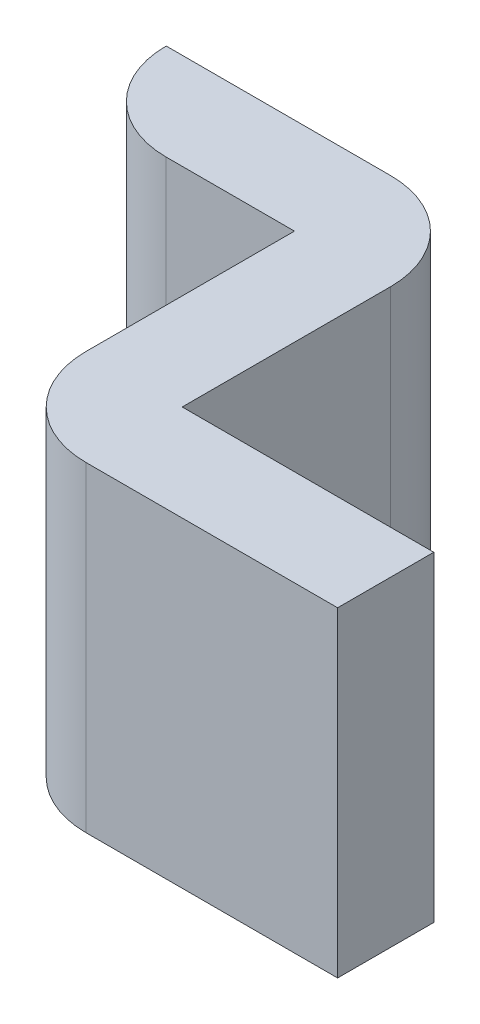
ISO-10303-21;
HEADER;
FILE_DESCRIPTION(('STEP AP214'),'2;1');
FILE_NAME('part.step','',(''),(''),'','','');
FILE_SCHEMA(('AUTOMOTIVE_DESIGN { 1 0 10303 214 1 1 1 1 }'));
ENDSEC;
DATA;
#1=APPLICATION_CONTEXT('core data for automotive mechanical design processes');
#2=APPLICATION_PROTOCOL_DEFINITION('international standard','automotive_design',2000,#1);
#3=PRODUCT_CONTEXT('',#1,'mechanical');
#4=PRODUCT('Part','Part','',(#3));
#5=PRODUCT_RELATED_PRODUCT_CATEGORY('part','',(#4));
#6=PRODUCT_DEFINITION_FORMATION('','',#4);
#7=PRODUCT_DEFINITION_CONTEXT('part definition',#1,'design');
#8=PRODUCT_DEFINITION('design','',#6,#7);
#9=PRODUCT_DEFINITION_SHAPE('','',#8);
#10=(LENGTH_UNIT() NAMED_UNIT(*) SI_UNIT(.MILLI.,.METRE.));
#11=(NAMED_UNIT(*) PLANE_ANGLE_UNIT() SI_UNIT($,.RADIAN.));
#12=(NAMED_UNIT(*) SI_UNIT($,.STERADIAN.) SOLID_ANGLE_UNIT());
#13=UNCERTAINTY_MEASURE_WITH_UNIT(LENGTH_MEASURE(1.E-05),#10,'distance_accuracy_value','');
#14=(GEOMETRIC_REPRESENTATION_CONTEXT(3) GLOBAL_UNCERTAINTY_ASSIGNED_CONTEXT((#13)) GLOBAL_UNIT_ASSIGNED_CONTEXT((#10,
#11,#12)) REPRESENTATION_CONTEXT('',''));
#15=CARTESIAN_POINT('',(0.,0.,0.));
#16=DIRECTION('',(0.,0.,1.));
#17=DIRECTION('',(1.,0.,0.));
#18=AXIS2_PLACEMENT_3D('',#15,#16,#17);
#19=CARTESIAN_POINT('',(1.4397,-0.127,0.));
#20=DIRECTION('',(0.,0.,1.));
#21=DIRECTION('',(1.,0.,0.));
#22=AXIS2_PLACEMENT_3D('',#19,#20,#21);
#23=PLANE('',#22);
#24=DIRECTION('',(0.,-1.,0.));
#25=VECTOR('',#24,1.);
#26=CARTESIAN_POINT('',(1.2619,-0.127,0.));
#27=LINE('',#26,#25);
#28=CARTESIAN_POINT('',(1.2619,0.127,0.));
#29=VERTEX_POINT('',#28);
#30=CARTESIAN_POINT('',(1.2619,-0.127,0.));
#31=VERTEX_POINT('',#30);
#32=EDGE_CURVE('E119',#29,#31,#27,.T.);
#33=ORIENTED_EDGE('',*,*,#32,.F.);
#34=DIRECTION('',(1.,0.,0.));
#35=VECTOR('',#34,1.);
#36=CARTESIAN_POINT('',(1.2619,0.127,0.));
#37=LINE('',#36,#35);
#38=CARTESIAN_POINT('',(1.4397,0.127,0.));
#39=VERTEX_POINT('',#38);
#40=EDGE_CURVE('E114',#29,#39,#37,.T.);
#41=ORIENTED_EDGE('',*,*,#40,.T.);
#42=DIRECTION('',(0.,-1.,0.));
#43=VECTOR('',#42,1.);
#44=CARTESIAN_POINT('',(1.4397,-0.127,0.));
#45=LINE('',#44,#43);
#46=CARTESIAN_POINT('',(1.4397,-0.127,0.));
#47=VERTEX_POINT('',#46);
#48=EDGE_CURVE('E90',#47,#39,#45,.F.);
#49=ORIENTED_EDGE('',*,*,#48,.F.);
#50=DIRECTION('',(1.,0.,0.));
#51=VECTOR('',#50,1.);
#52=CARTESIAN_POINT('',(1.2619,-0.127,0.));
#53=LINE('',#52,#51);
#54=EDGE_CURVE('E135',#31,#47,#53,.T.);
#55=ORIENTED_EDGE('',*,*,#54,.F.);
#56=EDGE_LOOP('',(#33,#41,#49,#55));
#57=FACE_BOUND('',#56,.T.);
#58=ADVANCED_FACE('F16',(#57),#23,.F.);
#59=CARTESIAN_POINT('',(1.4397,-0.127,0.0762));
#60=DIRECTION('',(0.,-1.,0.));
#61=DIRECTION('',(0.,0.,-1.));
#62=AXIS2_PLACEMENT_3D('',#59,#60,#61);
#63=CYLINDRICAL_SURFACE('',#62,0.0762);
#64=CARTESIAN_POINT('',(1.4397,0.127,0.0762));
#65=DIRECTION('',(0.,-1.,0.));
#66=DIRECTION('',(0.,0.,-1.));
#67=AXIS2_PLACEMENT_3D('',#64,#65,#66);
#68=CIRCLE('',#67,0.0762);
#69=CARTESIAN_POINT('',(1.5159,0.127,0.0762));
#70=VERTEX_POINT('',#69);
#71=EDGE_CURVE('E19',#39,#70,#68,.T.);
#72=ORIENTED_EDGE('',*,*,#71,.T.);
#73=DIRECTION('',(0.,1.,0.));
#74=VECTOR('',#73,1.);
#75=CARTESIAN_POINT('',(1.5159,-0.127,0.0762));
#76=LINE('',#75,#74);
#77=CARTESIAN_POINT('',(1.5159,-0.127,0.0762));
#78=VERTEX_POINT('',#77);
#79=EDGE_CURVE('E97',#70,#78,#76,.F.);
#80=ORIENTED_EDGE('',*,*,#79,.T.);
#81=CARTESIAN_POINT('',(1.4397,-0.127,0.0762));
#82=DIRECTION('',(0.,-1.,0.));
#83=DIRECTION('',(0.,0.,-1.));
#84=AXIS2_PLACEMENT_3D('',#81,#82,#83);
#85=CIRCLE('',#84,0.0762);
#86=EDGE_CURVE('E160',#47,#78,#85,.T.);
#87=ORIENTED_EDGE('',*,*,#86,.F.);
#88=ORIENTED_EDGE('',*,*,#48,.T.);
#89=EDGE_LOOP('',(#72,#80,#87,#88));
#90=FACE_BOUND('',#89,.T.);
#91=ADVANCED_FACE('F113',(#90),#63,.T.);
#92=CARTESIAN_POINT('',(1.5159,-0.127,0.2413));
#93=DIRECTION('',(-1.,0.,0.));
#94=DIRECTION('',(0.,0.,1.));
#95=AXIS2_PLACEMENT_3D('',#92,#93,#94);
#96=PLANE('',#95);
#97=ORIENTED_EDGE('',*,*,#79,.F.);
#98=DIRECTION('',(0.,0.,-1.));
#99=VECTOR('',#98,1.);
#100=CARTESIAN_POINT('',(1.5159,0.127,0.));
#101=LINE('',#100,#99);
#102=CARTESIAN_POINT('',(1.5159,0.127,0.2413));
#103=VERTEX_POINT('',#102);
#104=EDGE_CURVE('E101',#70,#103,#101,.F.);
#105=ORIENTED_EDGE('',*,*,#104,.T.);
#106=DIRECTION('',(0.,1.,0.));
#107=VECTOR('',#106,1.);
#108=CARTESIAN_POINT('',(1.5159,-0.127,0.2413));
#109=LINE('',#108,#107);
#110=CARTESIAN_POINT('',(1.5159,-0.127,0.2413));
#111=VERTEX_POINT('',#110);
#112=EDGE_CURVE('E103',#103,#111,#109,.F.);
#113=ORIENTED_EDGE('',*,*,#112,.T.);
#114=DIRECTION('',(0.,0.,-1.));
#115=VECTOR('',#114,1.);
#116=CARTESIAN_POINT('',(1.5159,-0.127,0.));
#117=LINE('',#116,#115);
#118=EDGE_CURVE('E102',#78,#111,#117,.F.);
#119=ORIENTED_EDGE('',*,*,#118,.F.);
#120=EDGE_LOOP('',(#97,#105,#113,#119));
#121=FACE_BOUND('',#120,.T.);
#122=ADVANCED_FACE('F99',(#121),#96,.F.);
#123=CARTESIAN_POINT('',(1.7152,-0.127,0.2413));
#124=DIRECTION('',(0.,0.,1.));
#125=DIRECTION('',(1.,0.,0.));
#126=AXIS2_PLACEMENT_3D('',#123,#124,#125);
#127=PLANE('',#126);
#128=ORIENTED_EDGE('',*,*,#112,.F.);
#129=DIRECTION('',(1.,0.,0.));
#130=VECTOR('',#129,1.);
#131=CARTESIAN_POINT('',(1.2619,0.127,0.2413));
#132=LINE('',#131,#130);
#133=CARTESIAN_POINT('',(1.7152,0.127,0.2413));
#134=VERTEX_POINT('',#133);
#135=EDGE_CURVE('E111',#103,#134,#132,.T.);
#136=ORIENTED_EDGE('',*,*,#135,.T.);
#137=DIRECTION('',(0.,1.,0.));
#138=VECTOR('',#137,1.);
#139=CARTESIAN_POINT('',(1.7152,-0.127,0.2413));
#140=LINE('',#139,#138);
#141=CARTESIAN_POINT('',(1.7152,-0.127,0.2413));
#142=VERTEX_POINT('',#141);
#143=EDGE_CURVE('E132',#134,#142,#140,.F.);
#144=ORIENTED_EDGE('',*,*,#143,.T.);
#145=DIRECTION('',(1.,0.,0.));
#146=VECTOR('',#145,1.);
#147=CARTESIAN_POINT('',(1.2619,-0.127,0.2413));
#148=LINE('',#147,#146);
#149=EDGE_CURVE('E139',#111,#142,#148,.T.);
#150=ORIENTED_EDGE('',*,*,#149,.F.);
#151=EDGE_LOOP('',(#128,#136,#144,#150));
#152=FACE_BOUND('',#151,.T.);
#153=ADVANCED_FACE('F220',(#152),#127,.F.);
#154=CARTESIAN_POINT('',(1.4397,-0.127,0.0762));
#155=DIRECTION('',(1.,0.,0.));
#156=DIRECTION('',(0.,0.,-1.));
#157=AXIS2_PLACEMENT_3D('',#154,#155,#156);
#158=PLANE('',#157);
#159=DIRECTION('',(0.,-1.,0.));
#160=VECTOR('',#159,1.);
#161=CARTESIAN_POINT('',(1.4397,-0.127,0.2413));
#162=LINE('',#161,#160);
#163=CARTESIAN_POINT('',(1.4397,0.127,0.2413));
#164=VERTEX_POINT('',#163);
#165=CARTESIAN_POINT('',(1.4397,-0.127,0.2413));
#166=VERTEX_POINT('',#165);
#167=EDGE_CURVE('E115',#164,#166,#162,.T.);
#168=ORIENTED_EDGE('',*,*,#167,.F.);
#169=DIRECTION('',(0.,0.,-1.));
#170=VECTOR('',#169,1.);
#171=CARTESIAN_POINT('',(1.4397,0.127,0.));
#172=LINE('',#171,#170);
#173=CARTESIAN_POINT('',(1.4397,0.127,0.0762));
#174=VERTEX_POINT('',#173);
#175=EDGE_CURVE('E166',#164,#174,#172,.T.);
#176=ORIENTED_EDGE('',*,*,#175,.T.);
#177=DIRECTION('',(0.,1.,0.));
#178=VECTOR('',#177,1.);
#179=CARTESIAN_POINT('',(1.4397,-0.127,0.0762));
#180=LINE('',#179,#178);
#181=CARTESIAN_POINT('',(1.4397,-0.127,0.0762));
#182=VERTEX_POINT('',#181);
#183=EDGE_CURVE('E127',#174,#182,#180,.F.);
#184=ORIENTED_EDGE('',*,*,#183,.T.);
#185=DIRECTION('',(0.,0.,-1.));
#186=VECTOR('',#185,1.);
#187=CARTESIAN_POINT('',(1.4397,-0.127,0.));
#188=LINE('',#187,#186);
#189=EDGE_CURVE('E159',#166,#182,#188,.T.);
#190=ORIENTED_EDGE('',*,*,#189,.F.);
#191=EDGE_LOOP('',(#168,#176,#184,#190));
#192=FACE_BOUND('',#191,.T.);
#193=ADVANCED_FACE('F229',(#192),#158,.F.);
#194=CARTESIAN_POINT('',(1.3381,-0.127,0.0762));
#195=DIRECTION('',(0.,0.,-1.));
#196=DIRECTION('',(-1.,0.,0.));
#197=AXIS2_PLACEMENT_3D('',#194,#195,#196);
#198=PLANE('',#197);
#199=ORIENTED_EDGE('',*,*,#183,.F.);
#200=DIRECTION('',(1.,0.,0.));
#201=VECTOR('',#200,1.);
#202=CARTESIAN_POINT('',(1.2619,0.127,0.0762));
#203=LINE('',#202,#201);
#204=CARTESIAN_POINT('',(1.3381,0.127,0.0762));
#205=VERTEX_POINT('',#204);
#206=EDGE_CURVE('E164',#174,#205,#203,.F.);
#207=ORIENTED_EDGE('',*,*,#206,.T.);
#208=DIRECTION('',(0.,-1.,0.));
#209=VECTOR('',#208,1.);
#210=CARTESIAN_POINT('',(1.3381,-0.127,0.0762));
#211=LINE('',#210,#209);
#212=CARTESIAN_POINT('',(1.3381,-0.127,0.0762));
#213=VERTEX_POINT('',#212);
#214=EDGE_CURVE('E125',#213,#205,#211,.F.);
#215=ORIENTED_EDGE('',*,*,#214,.F.);
#216=DIRECTION('',(1.,0.,0.));
#217=VECTOR('',#216,1.);
#218=CARTESIAN_POINT('',(1.2619,-0.127,0.0762));
#219=LINE('',#218,#217);
#220=EDGE_CURVE('E155',#182,#213,#219,.F.);
#221=ORIENTED_EDGE('',*,*,#220,.F.);
#222=EDGE_LOOP('',(#199,#207,#215,#221));
#223=FACE_BOUND('',#222,.T.);
#224=ADVANCED_FACE('F214',(#223),#198,.F.);
#225=CARTESIAN_POINT('',(1.3381,-0.127,0.));
#226=DIRECTION('',(0.,-1.,0.));
#227=DIRECTION('',(0.,0.,-1.));
#228=AXIS2_PLACEMENT_3D('',#225,#226,#227);
#229=CYLINDRICAL_SURFACE('',#228,0.0762);
#230=CARTESIAN_POINT('',(1.3381,0.127,0.));
#231=DIRECTION('',(0.,-1.,0.));
#232=DIRECTION('',(0.,0.,-1.));
#233=AXIS2_PLACEMENT_3D('',#230,#231,#232);
#234=CIRCLE('',#233,0.0762);
#235=EDGE_CURVE('E162',#205,#29,#234,.T.);
#236=ORIENTED_EDGE('',*,*,#235,.T.);
#237=ORIENTED_EDGE('',*,*,#32,.T.);
#238=CARTESIAN_POINT('',(1.3381,-0.127,0.));
#239=DIRECTION('',(0.,-1.,0.));
#240=DIRECTION('',(0.,0.,-1.));
#241=AXIS2_PLACEMENT_3D('',#238,#239,#240);
#242=CIRCLE('',#241,0.0762);
#243=EDGE_CURVE('E151',#213,#31,#242,.T.);
#244=ORIENTED_EDGE('',*,*,#243,.F.);
#245=ORIENTED_EDGE('',*,*,#214,.T.);
#246=EDGE_LOOP('',(#236,#237,#244,#245));
#247=FACE_BOUND('',#246,.T.);
#248=ADVANCED_FACE('F217',(#247),#229,.T.);
#249=CARTESIAN_POINT('',(1.5159,-0.127,0.2413));
#250=DIRECTION('',(0.,-1.,0.));
#251=DIRECTION('',(0.,0.,-1.));
#252=AXIS2_PLACEMENT_3D('',#249,#250,#251);
#253=CYLINDRICAL_SURFACE('',#252,0.0762);
#254=CARTESIAN_POINT('',(1.5159,0.127,0.2413));
#255=DIRECTION('',(0.,-1.,0.));
#256=DIRECTION('',(0.,0.,-1.));
#257=AXIS2_PLACEMENT_3D('',#254,#255,#256);
#258=CIRCLE('',#257,0.0762);
#259=CARTESIAN_POINT('',(1.5159,0.127,0.3175));
#260=VERTEX_POINT('',#259);
#261=EDGE_CURVE('E148',#260,#164,#258,.T.);
#262=ORIENTED_EDGE('',*,*,#261,.T.);
#263=ORIENTED_EDGE('',*,*,#167,.T.);
#264=CARTESIAN_POINT('',(1.5159,-0.127,0.2413));
#265=DIRECTION('',(0.,-1.,0.));
#266=DIRECTION('',(0.,0.,-1.));
#267=AXIS2_PLACEMENT_3D('',#264,#265,#266);
#268=CIRCLE('',#267,0.0762);
#269=CARTESIAN_POINT('',(1.5159,-0.127,0.3175));
#270=VERTEX_POINT('',#269);
#271=EDGE_CURVE('E156',#270,#166,#268,.T.);
#272=ORIENTED_EDGE('',*,*,#271,.F.);
#273=DIRECTION('',(0.,1.,0.));
#274=VECTOR('',#273,1.);
#275=CARTESIAN_POINT('',(1.5159,-0.127,0.3175));
#276=LINE('',#275,#274);
#277=EDGE_CURVE('E154',#270,#260,#276,.T.);
#278=ORIENTED_EDGE('',*,*,#277,.T.);
#279=EDGE_LOOP('',(#262,#263,#272,#278));
#280=FACE_BOUND('',#279,.T.);
#281=ADVANCED_FACE('F230',(#280),#253,.T.);
#282=CARTESIAN_POINT('',(1.2619,0.127,0.));
#283=DIRECTION('',(0.,-1.,0.));
#284=DIRECTION('',(0.,0.,-1.));
#285=AXIS2_PLACEMENT_3D('',#282,#283,#284);
#286=PLANE('',#285);
#287=ORIENTED_EDGE('',*,*,#206,.F.);
#288=ORIENTED_EDGE('',*,*,#175,.F.);
#289=ORIENTED_EDGE('',*,*,#261,.F.);
#290=DIRECTION('',(-1.,0.,0.));
#291=VECTOR('',#290,1.);
#292=CARTESIAN_POINT('',(1.5159,0.127,0.3175));
#293=LINE('',#292,#291);
#294=CARTESIAN_POINT('',(1.7152,0.127,0.3175));
#295=VERTEX_POINT('',#294);
#296=EDGE_CURVE('E182',#260,#295,#293,.F.);
#297=ORIENTED_EDGE('',*,*,#296,.T.);
#298=DIRECTION('',(0.,0.,1.));
#299=VECTOR('',#298,1.);
#300=CARTESIAN_POINT('',(1.7152,0.127,0.3175));
#301=LINE('',#300,#299);
#302=EDGE_CURVE('E136',#295,#134,#301,.F.);
#303=ORIENTED_EDGE('',*,*,#302,.T.);
#304=ORIENTED_EDGE('',*,*,#135,.F.);
#305=ORIENTED_EDGE('',*,*,#104,.F.);
#306=ORIENTED_EDGE('',*,*,#71,.F.);
#307=ORIENTED_EDGE('',*,*,#40,.F.);
#308=ORIENTED_EDGE('',*,*,#235,.F.);
#309=EDGE_LOOP('',(#287,#288,#289,#297,#303,#304,#305,#306,#307,#308));
#310=FACE_BOUND('',#309,.T.);
#311=ADVANCED_FACE('F108',(#310),#286,.F.);
#312=CARTESIAN_POINT('',(1.7152,-0.127,0.3175));
#313=DIRECTION('',(-1.,0.,0.));
#314=DIRECTION('',(0.,0.,1.));
#315=AXIS2_PLACEMENT_3D('',#312,#313,#314);
#316=PLANE('',#315);
#317=ORIENTED_EDGE('',*,*,#143,.F.);
#318=ORIENTED_EDGE('',*,*,#302,.F.);
#319=DIRECTION('',(0.,1.,0.));
#320=VECTOR('',#319,1.);
#321=CARTESIAN_POINT('',(1.7152,-0.127,0.3175));
#322=LINE('',#321,#320);
#323=CARTESIAN_POINT('',(1.7152,-0.127,0.3175));
#324=VERTEX_POINT('',#323);
#325=EDGE_CURVE('E25',#295,#324,#322,.F.);
#326=ORIENTED_EDGE('',*,*,#325,.T.);
#327=DIRECTION('',(0.,0.,-1.));
#328=VECTOR('',#327,1.);
#329=CARTESIAN_POINT('',(1.7152,-0.127,0.));
#330=LINE('',#329,#328);
#331=EDGE_CURVE('E33',#142,#324,#330,.F.);
#332=ORIENTED_EDGE('',*,*,#331,.F.);
#333=EDGE_LOOP('',(#317,#318,#326,#332));
#334=FACE_BOUND('',#333,.T.);
#335=ADVANCED_FACE('F223',(#334),#316,.F.);
#336=CARTESIAN_POINT('',(1.2619,-0.127,0.));
#337=DIRECTION('',(0.,-1.,0.));
#338=DIRECTION('',(0.,0.,-1.));
#339=AXIS2_PLACEMENT_3D('',#336,#337,#338);
#340=PLANE('',#339);
#341=ORIENTED_EDGE('',*,*,#220,.T.);
#342=ORIENTED_EDGE('',*,*,#243,.T.);
#343=ORIENTED_EDGE('',*,*,#54,.T.);
#344=ORIENTED_EDGE('',*,*,#86,.T.);
#345=ORIENTED_EDGE('',*,*,#118,.T.);
#346=ORIENTED_EDGE('',*,*,#149,.T.);
#347=ORIENTED_EDGE('',*,*,#331,.T.);
#348=DIRECTION('',(-1.,0.,0.));
#349=VECTOR('',#348,1.);
#350=CARTESIAN_POINT('',(1.5159,-0.127,0.3175));
#351=LINE('',#350,#349);
#352=EDGE_CURVE('E11',#324,#270,#351,.T.);
#353=ORIENTED_EDGE('',*,*,#352,.T.);
#354=ORIENTED_EDGE('',*,*,#271,.T.);
#355=ORIENTED_EDGE('',*,*,#189,.T.);
#356=EDGE_LOOP('',(#341,#342,#343,#344,#345,#346,#347,#353,#354,#355));
#357=FACE_BOUND('',#356,.T.);
#358=ADVANCED_FACE('F209',(#357),#340,.T.);
#359=CARTESIAN_POINT('',(1.5159,-0.127,0.3175));
#360=DIRECTION('',(0.,0.,-1.));
#361=DIRECTION('',(-1.,0.,0.));
#362=AXIS2_PLACEMENT_3D('',#359,#360,#361);
#363=PLANE('',#362);
#364=ORIENTED_EDGE('',*,*,#325,.F.);
#365=ORIENTED_EDGE('',*,*,#296,.F.);
#366=ORIENTED_EDGE('',*,*,#277,.F.);
#367=ORIENTED_EDGE('',*,*,#352,.F.);
#368=EDGE_LOOP('',(#364,#365,#366,#367));
#369=FACE_BOUND('',#368,.T.);
#370=ADVANCED_FACE('F227',(#369),#363,.F.);
#371=CLOSED_SHELL('',(#58,#91,#122,#153,#193,#224,#248,#281,#311,#335,#358,#370));
#372=MANIFOLD_SOLID_BREP('B1',#371);
#373=ADVANCED_BREP_SHAPE_REPRESENTATION('',(#18,#372),#14);
#374=SHAPE_DEFINITION_REPRESENTATION(#9,#373);
ENDSEC;
END-ISO-10303-21;
